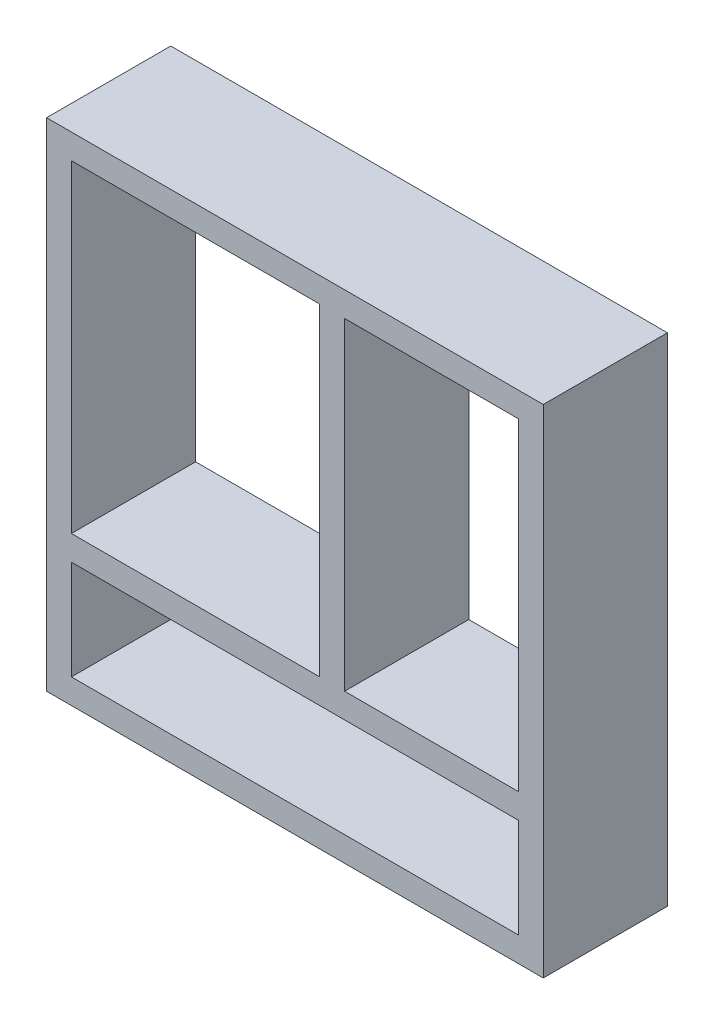
ISO-10303-21;
HEADER;
FILE_DESCRIPTION(('STEP AP214'),'2;1');
FILE_NAME('part.step','',(''),(''),'','','');
FILE_SCHEMA(('AUTOMOTIVE_DESIGN { 1 0 10303 214 1 1 1 1 }'));
ENDSEC;
DATA;
#1=APPLICATION_CONTEXT('core data for automotive mechanical design processes');
#2=APPLICATION_PROTOCOL_DEFINITION('international standard','automotive_design',2000,#1);
#3=PRODUCT_CONTEXT('',#1,'mechanical');
#4=PRODUCT('Part','Part','',(#3));
#5=PRODUCT_RELATED_PRODUCT_CATEGORY('part','',(#4));
#6=PRODUCT_DEFINITION_FORMATION('','',#4);
#7=PRODUCT_DEFINITION_CONTEXT('part definition',#1,'design');
#8=PRODUCT_DEFINITION('design','',#6,#7);
#9=PRODUCT_DEFINITION_SHAPE('','',#8);
#10=(LENGTH_UNIT() NAMED_UNIT(*) SI_UNIT(.MILLI.,.METRE.));
#11=(NAMED_UNIT(*) PLANE_ANGLE_UNIT() SI_UNIT($,.RADIAN.));
#12=(NAMED_UNIT(*) SI_UNIT($,.STERADIAN.) SOLID_ANGLE_UNIT());
#13=UNCERTAINTY_MEASURE_WITH_UNIT(LENGTH_MEASURE(1.E-05),#10,'distance_accuracy_value','');
#14=(GEOMETRIC_REPRESENTATION_CONTEXT(3) GLOBAL_UNCERTAINTY_ASSIGNED_CONTEXT((#13)) GLOBAL_UNIT_ASSIGNED_CONTEXT((#10,
#11,#12)) REPRESENTATION_CONTEXT('',''));
#15=CARTESIAN_POINT('',(0.,0.,0.));
#16=DIRECTION('',(0.,0.,1.));
#17=DIRECTION('',(1.,0.,0.));
#18=AXIS2_PLACEMENT_3D('',#15,#16,#17);
#19=CARTESIAN_POINT('',(0.,-65.,50.));
#20=DIRECTION('',(0.,-1.,0.));
#21=DIRECTION('',(1.,0.,0.));
#22=AXIS2_PLACEMENT_3D('',#19,#20,#21);
#23=PLANE('',#22);
#24=DIRECTION('',(-1.,0.,0.));
#25=VECTOR('',#24,1.);
#26=CARTESIAN_POINT('',(0.,-65.,0.));
#27=LINE('',#26,#25);
#28=CARTESIAN_POINT('',(90.,-65.,0.));
#29=VERTEX_POINT('',#28);
#30=CARTESIAN_POINT('',(20.,-65.,0.));
#31=VERTEX_POINT('',#30);
#32=EDGE_CURVE('E241',#29,#31,#27,.T.);
#33=ORIENTED_EDGE('',*,*,#32,.T.);
#34=DIRECTION('',(0.,0.,-1.));
#35=VECTOR('',#34,1.);
#36=CARTESIAN_POINT('',(20.,-65.,50.));
#37=LINE('',#36,#35);
#38=CARTESIAN_POINT('',(20.,-65.,50.));
#39=VERTEX_POINT('',#38);
#40=EDGE_CURVE('E11',#39,#31,#37,.T.);
#41=ORIENTED_EDGE('',*,*,#40,.F.);
#42=DIRECTION('',(-1.,0.,0.));
#43=VECTOR('',#42,1.);
#44=CARTESIAN_POINT('',(0.,-65.,50.));
#45=LINE('',#44,#43);
#46=CARTESIAN_POINT('',(90.,-65.,50.));
#47=VERTEX_POINT('',#46);
#48=EDGE_CURVE('E175',#47,#39,#45,.T.);
#49=ORIENTED_EDGE('',*,*,#48,.F.);
#50=DIRECTION('',(0.,0.,-1.));
#51=VECTOR('',#50,1.);
#52=CARTESIAN_POINT('',(90.,-65.,50.));
#53=LINE('',#52,#51);
#54=EDGE_CURVE('E67',#47,#29,#53,.T.);
#55=ORIENTED_EDGE('',*,*,#54,.T.);
#56=EDGE_LOOP('',(#33,#41,#49,#55));
#57=FACE_BOUND('',#56,.T.);
#58=ADVANCED_FACE('F47',(#57),#23,.F.);
#59=CARTESIAN_POINT('',(20.,0.,50.));
#60=DIRECTION('',(-1.,0.,0.));
#61=DIRECTION('',(0.,0.,1.));
#62=AXIS2_PLACEMENT_3D('',#59,#60,#61);
#63=PLANE('',#62);
#64=DIRECTION('',(0.,1.,0.));
#65=VECTOR('',#64,1.);
#66=CARTESIAN_POINT('',(20.,0.,0.));
#67=LINE('',#66,#65);
#68=CARTESIAN_POINT('',(20.,65.,0.));
#69=VERTEX_POINT('',#68);
#70=EDGE_CURVE('E182',#31,#69,#67,.T.);
#71=ORIENTED_EDGE('',*,*,#70,.T.);
#72=DIRECTION('',(0.,0.,-1.));
#73=VECTOR('',#72,1.);
#74=CARTESIAN_POINT('',(20.,65.,50.));
#75=LINE('',#74,#73);
#76=CARTESIAN_POINT('',(20.,65.,50.));
#77=VERTEX_POINT('',#76);
#78=EDGE_CURVE('E58',#77,#69,#75,.T.);
#79=ORIENTED_EDGE('',*,*,#78,.F.);
#80=DIRECTION('',(0.,1.,0.));
#81=VECTOR('',#80,1.);
#82=CARTESIAN_POINT('',(20.,0.,50.));
#83=LINE('',#82,#81);
#84=EDGE_CURVE('E169',#39,#77,#83,.T.);
#85=ORIENTED_EDGE('',*,*,#84,.F.);
#86=ORIENTED_EDGE('',*,*,#40,.T.);
#87=EDGE_LOOP('',(#71,#79,#85,#86));
#88=FACE_BOUND('',#87,.T.);
#89=ADVANCED_FACE('F181',(#88),#63,.F.);
#90=CARTESIAN_POINT('',(0.,65.,50.));
#91=DIRECTION('',(0.,-1.,0.));
#92=DIRECTION('',(1.,0.,0.));
#93=AXIS2_PLACEMENT_3D('',#90,#91,#92);
#94=PLANE('',#93);
#95=DIRECTION('',(-1.,0.,0.));
#96=VECTOR('',#95,1.);
#97=CARTESIAN_POINT('',(0.,65.,0.));
#98=LINE('',#97,#96);
#99=CARTESIAN_POINT('',(89.9999999999999,65.,0.));
#100=VERTEX_POINT('',#99);
#101=EDGE_CURVE('E246',#100,#69,#98,.T.);
#102=ORIENTED_EDGE('',*,*,#101,.F.);
#103=DIRECTION('',(0.,0.,-1.));
#104=VECTOR('',#103,1.);
#105=CARTESIAN_POINT('',(89.9999999999999,65.,50.));
#106=LINE('',#105,#104);
#107=CARTESIAN_POINT('',(89.9999999999999,65.,50.));
#108=VERTEX_POINT('',#107);
#109=EDGE_CURVE('E117',#108,#100,#106,.T.);
#110=ORIENTED_EDGE('',*,*,#109,.F.);
#111=DIRECTION('',(-1.,0.,0.));
#112=VECTOR('',#111,1.);
#113=CARTESIAN_POINT('',(0.,65.,50.));
#114=LINE('',#113,#112);
#115=EDGE_CURVE('E174',#108,#77,#114,.T.);
#116=ORIENTED_EDGE('',*,*,#115,.T.);
#117=ORIENTED_EDGE('',*,*,#78,.T.);
#118=EDGE_LOOP('',(#102,#110,#116,#117));
#119=FACE_BOUND('',#118,.T.);
#120=ADVANCED_FACE('F187',(#119),#94,.T.);
#121=CARTESIAN_POINT('',(9.99999999999999,0.,50.));
#122=DIRECTION('',(-1.,0.,0.));
#123=DIRECTION('',(0.,0.,1.));
#124=AXIS2_PLACEMENT_3D('',#121,#122,#123);
#125=PLANE('',#124);
#126=DIRECTION('',(0.,1.,0.));
#127=VECTOR('',#126,1.);
#128=CARTESIAN_POINT('',(9.99999999999999,0.,0.));
#129=LINE('',#128,#127);
#130=CARTESIAN_POINT('',(9.99999999999999,-65.,0.));
#131=VERTEX_POINT('',#130);
#132=CARTESIAN_POINT('',(9.99999999999999,65.,0.));
#133=VERTEX_POINT('',#132);
#134=EDGE_CURVE('E225',#131,#133,#129,.T.);
#135=ORIENTED_EDGE('',*,*,#134,.F.);
#136=DIRECTION('',(0.,0.,-1.));
#137=VECTOR('',#136,1.);
#138=CARTESIAN_POINT('',(9.99999999999999,-65.,50.));
#139=LINE('',#138,#137);
#140=CARTESIAN_POINT('',(9.99999999999999,-65.,50.));
#141=VERTEX_POINT('',#140);
#142=EDGE_CURVE('E256',#141,#131,#139,.T.);
#143=ORIENTED_EDGE('',*,*,#142,.F.);
#144=DIRECTION('',(0.,1.,0.));
#145=VECTOR('',#144,1.);
#146=CARTESIAN_POINT('',(9.99999999999999,0.,50.));
#147=LINE('',#146,#145);
#148=CARTESIAN_POINT('',(9.99999999999999,65.,50.));
#149=VERTEX_POINT('',#148);
#150=EDGE_CURVE('E336',#141,#149,#147,.T.);
#151=ORIENTED_EDGE('',*,*,#150,.T.);
#152=DIRECTION('',(0.,0.,-1.));
#153=VECTOR('',#152,1.);
#154=CARTESIAN_POINT('',(9.99999999999999,65.,50.));
#155=LINE('',#154,#153);
#156=EDGE_CURVE('E259',#149,#133,#155,.T.);
#157=ORIENTED_EDGE('',*,*,#156,.T.);
#158=EDGE_LOOP('',(#135,#143,#151,#157));
#159=FACE_BOUND('',#158,.T.);
#160=ADVANCED_FACE('F361',(#159),#125,.T.);
#161=CARTESIAN_POINT('',(0.,-65.,50.));
#162=DIRECTION('',(0.,1.,0.));
#163=DIRECTION('',(0.,0.,1.));
#164=AXIS2_PLACEMENT_3D('',#161,#162,#163);
#165=PLANE('',#164);
#166=DIRECTION('',(1.,0.,0.));
#167=VECTOR('',#166,1.);
#168=CARTESIAN_POINT('',(0.,-65.,0.));
#169=LINE('',#168,#167);
#170=CARTESIAN_POINT('',(-90.,-65.,0.));
#171=VERTEX_POINT('',#170);
#172=EDGE_CURVE('E229',#171,#131,#169,.T.);
#173=ORIENTED_EDGE('',*,*,#172,.F.);
#174=DIRECTION('',(0.,0.,-1.));
#175=VECTOR('',#174,1.);
#176=CARTESIAN_POINT('',(-90.,-65.,50.));
#177=LINE('',#176,#175);
#178=CARTESIAN_POINT('',(-90.,-65.,50.));
#179=VERTEX_POINT('',#178);
#180=EDGE_CURVE('E267',#179,#171,#177,.T.);
#181=ORIENTED_EDGE('',*,*,#180,.F.);
#182=DIRECTION('',(1.,0.,0.));
#183=VECTOR('',#182,1.);
#184=CARTESIAN_POINT('',(0.,-65.,50.));
#185=LINE('',#184,#183);
#186=EDGE_CURVE('E340',#179,#141,#185,.T.);
#187=ORIENTED_EDGE('',*,*,#186,.T.);
#188=ORIENTED_EDGE('',*,*,#142,.T.);
#189=EDGE_LOOP('',(#173,#181,#187,#188));
#190=FACE_BOUND('',#189,.T.);
#191=ADVANCED_FACE('F364',(#190),#165,.T.);
#192=CARTESIAN_POINT('',(-90.,0.,50.));
#193=DIRECTION('',(-1.,0.,0.));
#194=DIRECTION('',(0.,0.,1.));
#195=AXIS2_PLACEMENT_3D('',#192,#193,#194);
#196=PLANE('',#195);
#197=DIRECTION('',(0.,1.,0.));
#198=VECTOR('',#197,1.);
#199=CARTESIAN_POINT('',(-90.,0.,0.));
#200=LINE('',#199,#198);
#201=CARTESIAN_POINT('',(-90.,65.,0.));
#202=VERTEX_POINT('',#201);
#203=EDGE_CURVE('E233',#171,#202,#200,.T.);
#204=ORIENTED_EDGE('',*,*,#203,.T.);
#205=DIRECTION('',(0.,0.,-1.));
#206=VECTOR('',#205,1.);
#207=CARTESIAN_POINT('',(-90.,65.,50.));
#208=LINE('',#207,#206);
#209=CARTESIAN_POINT('',(-90.,65.,50.));
#210=VERTEX_POINT('',#209);
#211=EDGE_CURVE('E262',#210,#202,#208,.T.);
#212=ORIENTED_EDGE('',*,*,#211,.F.);
#213=DIRECTION('',(0.,1.,0.));
#214=VECTOR('',#213,1.);
#215=CARTESIAN_POINT('',(-90.,0.,50.));
#216=LINE('',#215,#214);
#217=EDGE_CURVE('E344',#179,#210,#216,.T.);
#218=ORIENTED_EDGE('',*,*,#217,.F.);
#219=ORIENTED_EDGE('',*,*,#180,.T.);
#220=EDGE_LOOP('',(#204,#212,#218,#219));
#221=FACE_BOUND('',#220,.T.);
#222=ADVANCED_FACE('F367',(#221),#196,.F.);
#223=CARTESIAN_POINT('',(-100.,0.,50.));
#224=DIRECTION('',(1.,0.,0.));
#225=DIRECTION('',(0.,1.,0.));
#226=AXIS2_PLACEMENT_3D('',#223,#224,#225);
#227=PLANE('',#226);
#228=DIRECTION('',(0.,-1.,0.));
#229=VECTOR('',#228,1.);
#230=CARTESIAN_POINT('',(-100.,0.,0.));
#231=LINE('',#230,#229);
#232=CARTESIAN_POINT('',(-100.,75.,0.));
#233=VERTEX_POINT('',#232);
#234=CARTESIAN_POINT('',(-100.,-125.,0.));
#235=VERTEX_POINT('',#234);
#236=EDGE_CURVE('E212',#233,#235,#231,.T.);
#237=ORIENTED_EDGE('',*,*,#236,.T.);
#238=DIRECTION('',(0.,0.,-1.));
#239=VECTOR('',#238,1.);
#240=CARTESIAN_POINT('',(-100.,-125.,50.));
#241=LINE('',#240,#239);
#242=CARTESIAN_POINT('',(-100.,-125.,50.));
#243=VERTEX_POINT('',#242);
#244=EDGE_CURVE('E263',#243,#235,#241,.T.);
#245=ORIENTED_EDGE('',*,*,#244,.F.);
#246=DIRECTION('',(0.,-1.,0.));
#247=VECTOR('',#246,1.);
#248=CARTESIAN_POINT('',(-100.,0.,50.));
#249=LINE('',#248,#247);
#250=CARTESIAN_POINT('',(-100.,75.,50.));
#251=VERTEX_POINT('',#250);
#252=EDGE_CURVE('E320',#251,#243,#249,.T.);
#253=ORIENTED_EDGE('',*,*,#252,.F.);
#254=DIRECTION('',(0.,0.,-1.));
#255=VECTOR('',#254,1.);
#256=CARTESIAN_POINT('',(-100.,75.,50.));
#257=LINE('',#256,#255);
#258=EDGE_CURVE('E272',#251,#233,#257,.T.);
#259=ORIENTED_EDGE('',*,*,#258,.T.);
#260=EDGE_LOOP('',(#237,#245,#253,#259));
#261=FACE_BOUND('',#260,.T.);
#262=ADVANCED_FACE('F394',(#261),#227,.F.);
#263=CARTESIAN_POINT('',(0.,-125.,50.));
#264=DIRECTION('',(0.,1.,0.));
#265=DIRECTION('',(0.,0.,1.));
#266=AXIS2_PLACEMENT_3D('',#263,#264,#265);
#267=PLANE('',#266);
#268=DIRECTION('',(1.,0.,0.));
#269=VECTOR('',#268,1.);
#270=CARTESIAN_POINT('',(0.,-125.,0.));
#271=LINE('',#270,#269);
#272=CARTESIAN_POINT('',(100.,-125.,0.));
#273=VERTEX_POINT('',#272);
#274=EDGE_CURVE('E216',#235,#273,#271,.T.);
#275=ORIENTED_EDGE('',*,*,#274,.T.);
#276=DIRECTION('',(0.,0.,-1.));
#277=VECTOR('',#276,1.);
#278=CARTESIAN_POINT('',(100.,-125.,50.));
#279=LINE('',#278,#277);
#280=CARTESIAN_POINT('',(100.,-125.,50.));
#281=VERTEX_POINT('',#280);
#282=EDGE_CURVE('E280',#281,#273,#279,.T.);
#283=ORIENTED_EDGE('',*,*,#282,.F.);
#284=DIRECTION('',(1.,0.,0.));
#285=VECTOR('',#284,1.);
#286=CARTESIAN_POINT('',(0.,-125.,50.));
#287=LINE('',#286,#285);
#288=EDGE_CURVE('E324',#243,#281,#287,.T.);
#289=ORIENTED_EDGE('',*,*,#288,.F.);
#290=ORIENTED_EDGE('',*,*,#244,.T.);
#291=EDGE_LOOP('',(#275,#283,#289,#290));
#292=FACE_BOUND('',#291,.T.);
#293=ADVANCED_FACE('F405',(#292),#267,.F.);
#294=CARTESIAN_POINT('',(100.,0.,50.));
#295=DIRECTION('',(-1.,0.,0.));
#296=DIRECTION('',(0.,-1.,0.));
#297=AXIS2_PLACEMENT_3D('',#294,#295,#296);
#298=PLANE('',#297);
#299=DIRECTION('',(0.,1.,0.));
#300=VECTOR('',#299,1.);
#301=CARTESIAN_POINT('',(100.,0.,0.));
#302=LINE('',#301,#300);
#303=CARTESIAN_POINT('',(100.,75.,0.));
#304=VERTEX_POINT('',#303);
#305=EDGE_CURVE('E219',#273,#304,#302,.T.);
#306=ORIENTED_EDGE('',*,*,#305,.T.);
#307=DIRECTION('',(0.,0.,-1.));
#308=VECTOR('',#307,1.);
#309=CARTESIAN_POINT('',(100.,75.,50.));
#310=LINE('',#309,#308);
#311=CARTESIAN_POINT('',(100.,75.,50.));
#312=VERTEX_POINT('',#311);
#313=EDGE_CURVE('E276',#312,#304,#310,.T.);
#314=ORIENTED_EDGE('',*,*,#313,.F.);
#315=DIRECTION('',(0.,1.,0.));
#316=VECTOR('',#315,1.);
#317=CARTESIAN_POINT('',(100.,0.,50.));
#318=LINE('',#317,#316);
#319=EDGE_CURVE('E330',#281,#312,#318,.T.);
#320=ORIENTED_EDGE('',*,*,#319,.F.);
#321=ORIENTED_EDGE('',*,*,#282,.T.);
#322=EDGE_LOOP('',(#306,#314,#320,#321));
#323=FACE_BOUND('',#322,.T.);
#324=ADVANCED_FACE('F402',(#323),#298,.F.);
#325=CARTESIAN_POINT('',(90.,0.,50.));
#326=DIRECTION('',(-1.,0.,0.));
#327=DIRECTION('',(0.,-1.,0.));
#328=AXIS2_PLACEMENT_3D('',#325,#326,#327);
#329=PLANE('',#328);
#330=DIRECTION('',(0.,1.,0.));
#331=VECTOR('',#330,1.);
#332=CARTESIAN_POINT('',(90.,0.,0.));
#333=LINE('',#332,#331);
#334=CARTESIAN_POINT('',(90.0000000000001,-115.,0.));
#335=VERTEX_POINT('',#334);
#336=CARTESIAN_POINT('',(90.,-75.,0.));
#337=VERTEX_POINT('',#336);
#338=EDGE_CURVE('E196',#335,#337,#333,.T.);
#339=ORIENTED_EDGE('',*,*,#338,.F.);
#340=DIRECTION('',(0.,0.,-1.));
#341=VECTOR('',#340,1.);
#342=CARTESIAN_POINT('',(90.0000000000001,-115.,50.));
#343=LINE('',#342,#341);
#344=CARTESIAN_POINT('',(90.0000000000001,-115.,50.));
#345=VERTEX_POINT('',#344);
#346=EDGE_CURVE('E51',#345,#335,#343,.T.);
#347=ORIENTED_EDGE('',*,*,#346,.F.);
#348=DIRECTION('',(0.,1.,0.));
#349=VECTOR('',#348,1.);
#350=CARTESIAN_POINT('',(90.,0.,50.));
#351=LINE('',#350,#349);
#352=CARTESIAN_POINT('',(90.,-75.,50.));
#353=VERTEX_POINT('',#352);
#354=EDGE_CURVE('E253',#345,#353,#351,.T.);
#355=ORIENTED_EDGE('',*,*,#354,.T.);
#356=DIRECTION('',(0.,0.,-1.));
#357=VECTOR('',#356,1.);
#358=CARTESIAN_POINT('',(90.,-75.,50.));
#359=LINE('',#358,#357);
#360=EDGE_CURVE('E192',#353,#337,#359,.T.);
#361=ORIENTED_EDGE('',*,*,#360,.T.);
#362=EDGE_LOOP('',(#339,#347,#355,#361));
#363=FACE_BOUND('',#362,.T.);
#364=ADVANCED_FACE('F49',(#363),#329,.T.);
#365=CARTESIAN_POINT('',(0.,-115.,50.));
#366=DIRECTION('',(0.,1.,0.));
#367=DIRECTION('',(0.,0.,1.));
#368=AXIS2_PLACEMENT_3D('',#365,#366,#367);
#369=PLANE('',#368);
#370=DIRECTION('',(1.,0.,0.));
#371=VECTOR('',#370,1.);
#372=CARTESIAN_POINT('',(0.,-115.,0.));
#373=LINE('',#372,#371);
#374=CARTESIAN_POINT('',(-90.,-115.,0.));
#375=VERTEX_POINT('',#374);
#376=EDGE_CURVE('E200',#375,#335,#373,.T.);
#377=ORIENTED_EDGE('',*,*,#376,.F.);
#378=DIRECTION('',(0.,0.,-1.));
#379=VECTOR('',#378,1.);
#380=CARTESIAN_POINT('',(-90.,-115.,50.));
#381=LINE('',#380,#379);
#382=CARTESIAN_POINT('',(-90.,-115.,50.));
#383=VERTEX_POINT('',#382);
#384=EDGE_CURVE('E291',#383,#375,#381,.T.);
#385=ORIENTED_EDGE('',*,*,#384,.F.);
#386=DIRECTION('',(1.,0.,0.));
#387=VECTOR('',#386,1.);
#388=CARTESIAN_POINT('',(0.,-115.,50.));
#389=LINE('',#388,#387);
#390=EDGE_CURVE('E302',#383,#345,#389,.T.);
#391=ORIENTED_EDGE('',*,*,#390,.T.);
#392=ORIENTED_EDGE('',*,*,#346,.T.);
#393=EDGE_LOOP('',(#377,#385,#391,#392));
#394=FACE_BOUND('',#393,.T.);
#395=ADVANCED_FACE('F300',(#394),#369,.T.);
#396=CARTESIAN_POINT('',(-90.,0.,50.));
#397=DIRECTION('',(1.,0.,0.));
#398=DIRECTION('',(0.,1.,0.));
#399=AXIS2_PLACEMENT_3D('',#396,#397,#398);
#400=PLANE('',#399);
#401=DIRECTION('',(0.,-1.,0.));
#402=VECTOR('',#401,1.);
#403=CARTESIAN_POINT('',(-90.,0.,0.));
#404=LINE('',#403,#402);
#405=CARTESIAN_POINT('',(-90.,-75.,0.));
#406=VERTEX_POINT('',#405);
#407=EDGE_CURVE('E204',#406,#375,#404,.T.);
#408=ORIENTED_EDGE('',*,*,#407,.F.);
#409=DIRECTION('',(0.,0.,-1.));
#410=VECTOR('',#409,1.);
#411=CARTESIAN_POINT('',(-90.,-75.,50.));
#412=LINE('',#411,#410);
#413=CARTESIAN_POINT('',(-90.,-75.,50.));
#414=VERTEX_POINT('',#413);
#415=EDGE_CURVE('E289',#414,#406,#412,.T.);
#416=ORIENTED_EDGE('',*,*,#415,.F.);
#417=DIRECTION('',(0.,-1.,0.));
#418=VECTOR('',#417,1.);
#419=CARTESIAN_POINT('',(-90.,0.,50.));
#420=LINE('',#419,#418);
#421=EDGE_CURVE('E309',#414,#383,#420,.T.);
#422=ORIENTED_EDGE('',*,*,#421,.T.);
#423=ORIENTED_EDGE('',*,*,#384,.T.);
#424=EDGE_LOOP('',(#408,#416,#422,#423));
#425=FACE_BOUND('',#424,.T.);
#426=ADVANCED_FACE('F307',(#425),#400,.T.);
#427=CARTESIAN_POINT('',(0.,65.,50.));
#428=DIRECTION('',(0.,1.,0.));
#429=DIRECTION('',(-1.,0.,0.));
#430=AXIS2_PLACEMENT_3D('',#427,#428,#429);
#431=PLANE('',#430);
#432=DIRECTION('',(1.,0.,0.));
#433=VECTOR('',#432,1.);
#434=CARTESIAN_POINT('',(0.,65.,0.));
#435=LINE('',#434,#433);
#436=EDGE_CURVE('E237',#202,#133,#435,.T.);
#437=ORIENTED_EDGE('',*,*,#436,.T.);
#438=ORIENTED_EDGE('',*,*,#156,.F.);
#439=DIRECTION('',(1.,0.,0.));
#440=VECTOR('',#439,1.);
#441=CARTESIAN_POINT('',(0.,65.,50.));
#442=LINE('',#441,#440);
#443=EDGE_CURVE('E348',#210,#149,#442,.T.);
#444=ORIENTED_EDGE('',*,*,#443,.F.);
#445=ORIENTED_EDGE('',*,*,#211,.T.);
#446=EDGE_LOOP('',(#437,#438,#444,#445));
#447=FACE_BOUND('',#446,.T.);
#448=ADVANCED_FACE('F358',(#447),#431,.F.);
#449=CARTESIAN_POINT('',(0.,75.,50.));
#450=DIRECTION('',(0.,-1.,0.));
#451=DIRECTION('',(1.,0.,0.));
#452=AXIS2_PLACEMENT_3D('',#449,#450,#451);
#453=PLANE('',#452);
#454=DIRECTION('',(-1.,0.,0.));
#455=VECTOR('',#454,1.);
#456=CARTESIAN_POINT('',(0.,75.,0.));
#457=LINE('',#456,#455);
#458=EDGE_CURVE('E222',#304,#233,#457,.T.);
#459=ORIENTED_EDGE('',*,*,#458,.T.);
#460=ORIENTED_EDGE('',*,*,#258,.F.);
#461=DIRECTION('',(-1.,0.,0.));
#462=VECTOR('',#461,1.);
#463=CARTESIAN_POINT('',(0.,75.,50.));
#464=LINE('',#463,#462);
#465=EDGE_CURVE('E333',#312,#251,#464,.T.);
#466=ORIENTED_EDGE('',*,*,#465,.F.);
#467=ORIENTED_EDGE('',*,*,#313,.T.);
#468=EDGE_LOOP('',(#459,#460,#466,#467));
#469=FACE_BOUND('',#468,.T.);
#470=ADVANCED_FACE('F380',(#469),#453,.F.);
#471=CARTESIAN_POINT('',(0.,-75.,50.));
#472=DIRECTION('',(0.,-1.,0.));
#473=DIRECTION('',(1.,0.,0.));
#474=AXIS2_PLACEMENT_3D('',#471,#472,#473);
#475=PLANE('',#474);
#476=DIRECTION('',(-1.,0.,0.));
#477=VECTOR('',#476,1.);
#478=CARTESIAN_POINT('',(0.,-75.,0.));
#479=LINE('',#478,#477);
#480=EDGE_CURVE('E208',#337,#406,#479,.T.);
#481=ORIENTED_EDGE('',*,*,#480,.F.);
#482=ORIENTED_EDGE('',*,*,#360,.F.);
#483=DIRECTION('',(-1.,0.,0.));
#484=VECTOR('',#483,1.);
#485=CARTESIAN_POINT('',(0.,-75.,50.));
#486=LINE('',#485,#484);
#487=EDGE_CURVE('E315',#353,#414,#486,.T.);
#488=ORIENTED_EDGE('',*,*,#487,.T.);
#489=ORIENTED_EDGE('',*,*,#415,.T.);
#490=EDGE_LOOP('',(#481,#482,#488,#489));
#491=FACE_BOUND('',#490,.T.);
#492=ADVANCED_FACE('F318',(#491),#475,.T.);
#493=CARTESIAN_POINT('',(90.,0.,50.));
#494=DIRECTION('',(-1.,0.,0.));
#495=DIRECTION('',(0.,-1.,0.));
#496=AXIS2_PLACEMENT_3D('',#493,#494,#495);
#497=PLANE('',#496);
#498=DIRECTION('',(0.,1.,0.));
#499=VECTOR('',#498,1.);
#500=CARTESIAN_POINT('',(90.,0.,0.));
#501=LINE('',#500,#499);
#502=EDGE_CURVE('E249',#29,#100,#501,.T.);
#503=ORIENTED_EDGE('',*,*,#502,.F.);
#504=ORIENTED_EDGE('',*,*,#54,.F.);
#505=DIRECTION('',(0.,1.,0.));
#506=VECTOR('',#505,1.);
#507=CARTESIAN_POINT('',(90.,0.,50.));
#508=LINE('',#507,#506);
#509=EDGE_CURVE('E189',#47,#108,#508,.T.);
#510=ORIENTED_EDGE('',*,*,#509,.T.);
#511=ORIENTED_EDGE('',*,*,#109,.T.);
#512=EDGE_LOOP('',(#503,#504,#510,#511));
#513=FACE_BOUND('',#512,.T.);
#514=ADVANCED_FACE('F372',(#513),#497,.T.);
#515=CARTESIAN_POINT('',(0.,0.,50.));
#516=DIRECTION('',(0.,0.,1.));
#517=DIRECTION('',(1.,0.,0.));
#518=AXIS2_PLACEMENT_3D('',#515,#516,#517);
#519=PLANE('',#518);
#520=ORIENTED_EDGE('',*,*,#354,.F.);
#521=ORIENTED_EDGE('',*,*,#390,.F.);
#522=ORIENTED_EDGE('',*,*,#421,.F.);
#523=ORIENTED_EDGE('',*,*,#487,.F.);
#524=EDGE_LOOP('',(#520,#521,#522,#523));
#525=FACE_BOUND('',#524,.T.);
#526=ORIENTED_EDGE('',*,*,#252,.T.);
#527=ORIENTED_EDGE('',*,*,#288,.T.);
#528=ORIENTED_EDGE('',*,*,#319,.T.);
#529=ORIENTED_EDGE('',*,*,#465,.T.);
#530=EDGE_LOOP('',(#526,#527,#528,#529));
#531=FACE_BOUND('',#530,.T.);
#532=ORIENTED_EDGE('',*,*,#150,.F.);
#533=ORIENTED_EDGE('',*,*,#186,.F.);
#534=ORIENTED_EDGE('',*,*,#217,.T.);
#535=ORIENTED_EDGE('',*,*,#443,.T.);
#536=EDGE_LOOP('',(#532,#533,#534,#535));
#537=FACE_BOUND('',#536,.T.);
#538=ORIENTED_EDGE('',*,*,#48,.T.);
#539=ORIENTED_EDGE('',*,*,#84,.T.);
#540=ORIENTED_EDGE('',*,*,#115,.F.);
#541=ORIENTED_EDGE('',*,*,#509,.F.);
#542=EDGE_LOOP('',(#538,#539,#540,#541));
#543=FACE_BOUND('',#542,.T.);
#544=ADVANCED_FACE('F171',(#525,#531,#537,#543),#519,.T.);
#545=CARTESIAN_POINT('',(0.,0.,0.));
#546=DIRECTION('',(0.,0.,1.));
#547=DIRECTION('',(1.,0.,0.));
#548=AXIS2_PLACEMENT_3D('',#545,#546,#547);
#549=PLANE('',#548);
#550=ORIENTED_EDGE('',*,*,#338,.T.);
#551=ORIENTED_EDGE('',*,*,#480,.T.);
#552=ORIENTED_EDGE('',*,*,#407,.T.);
#553=ORIENTED_EDGE('',*,*,#376,.T.);
#554=EDGE_LOOP('',(#550,#551,#552,#553));
#555=FACE_BOUND('',#554,.T.);
#556=ORIENTED_EDGE('',*,*,#236,.F.);
#557=ORIENTED_EDGE('',*,*,#458,.F.);
#558=ORIENTED_EDGE('',*,*,#305,.F.);
#559=ORIENTED_EDGE('',*,*,#274,.F.);
#560=EDGE_LOOP('',(#556,#557,#558,#559));
#561=FACE_BOUND('',#560,.T.);
#562=ORIENTED_EDGE('',*,*,#134,.T.);
#563=ORIENTED_EDGE('',*,*,#436,.F.);
#564=ORIENTED_EDGE('',*,*,#203,.F.);
#565=ORIENTED_EDGE('',*,*,#172,.T.);
#566=EDGE_LOOP('',(#562,#563,#564,#565));
#567=FACE_BOUND('',#566,.T.);
#568=ORIENTED_EDGE('',*,*,#32,.F.);
#569=ORIENTED_EDGE('',*,*,#502,.T.);
#570=ORIENTED_EDGE('',*,*,#101,.T.);
#571=ORIENTED_EDGE('',*,*,#70,.F.);
#572=EDGE_LOOP('',(#568,#569,#570,#571));
#573=FACE_BOUND('',#572,.T.);
#574=ADVANCED_FACE('F305',(#555,#561,#567,#573),#549,.F.);
#575=CLOSED_SHELL('',(#58,#89,#120,#160,#191,#222,#262,#293,#324,#364,#395,#426,#448,#470,#492,
#514,#544,#574));
#576=MANIFOLD_SOLID_BREP('B2',#575);
#577=ADVANCED_BREP_SHAPE_REPRESENTATION('',(#18,#576),#14);
#578=SHAPE_DEFINITION_REPRESENTATION(#9,#577);
ENDSEC;
END-ISO-10303-21;
